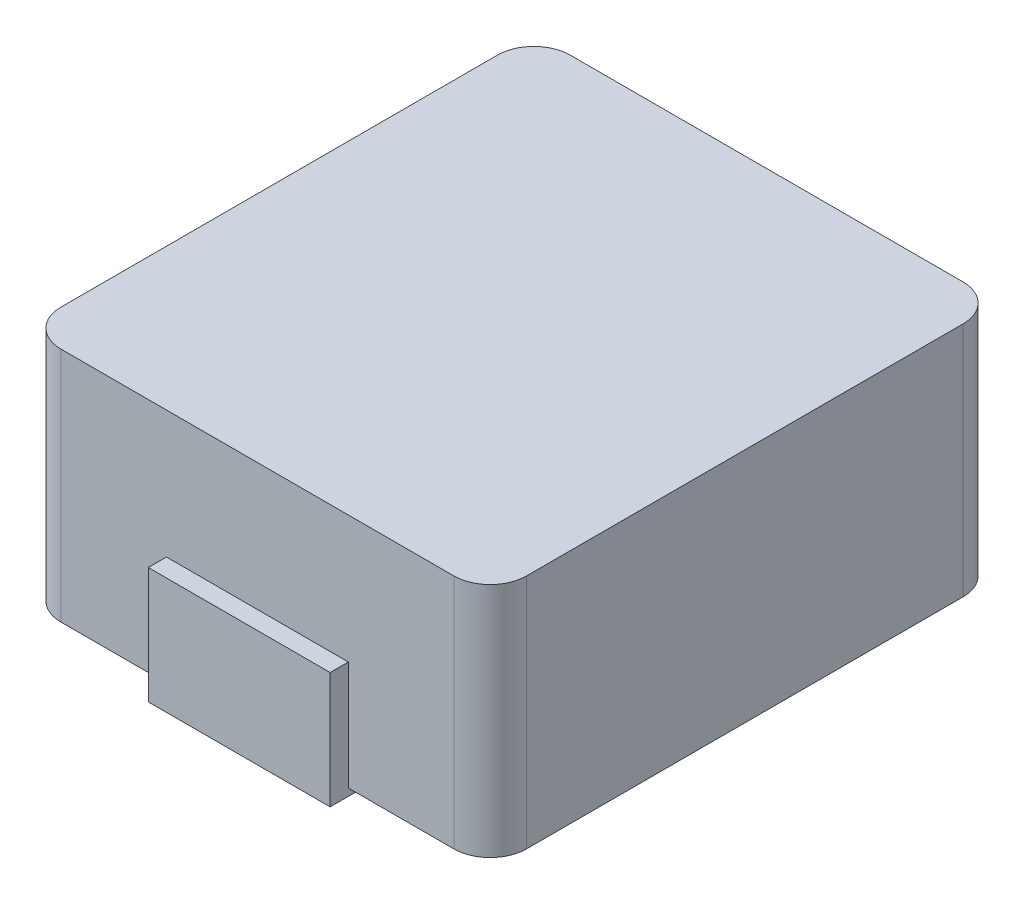
ISO-10303-21;
HEADER;
FILE_DESCRIPTION(('STEP AP214'),'2;1');
FILE_NAME('part.step','',(''),(''),'','','');
FILE_SCHEMA(('AUTOMOTIVE_DESIGN { 1 0 10303 214 1 1 1 1 }'));
ENDSEC;
DATA;
#1=APPLICATION_CONTEXT('core data for automotive mechanical design processes');
#2=APPLICATION_PROTOCOL_DEFINITION('international standard','automotive_design',2000,#1);
#3=PRODUCT_CONTEXT('',#1,'mechanical');
#4=PRODUCT('Part','Part','',(#3));
#5=PRODUCT_RELATED_PRODUCT_CATEGORY('part','',(#4));
#6=PRODUCT_DEFINITION_FORMATION('','',#4);
#7=PRODUCT_DEFINITION_CONTEXT('part definition',#1,'design');
#8=PRODUCT_DEFINITION('design','',#6,#7);
#9=PRODUCT_DEFINITION_SHAPE('','',#8);
#10=(LENGTH_UNIT() NAMED_UNIT(*) SI_UNIT(.MILLI.,.METRE.));
#11=(NAMED_UNIT(*) PLANE_ANGLE_UNIT() SI_UNIT($,.RADIAN.));
#12=(NAMED_UNIT(*) SI_UNIT($,.STERADIAN.) SOLID_ANGLE_UNIT());
#13=UNCERTAINTY_MEASURE_WITH_UNIT(LENGTH_MEASURE(1.E-05),#10,'distance_accuracy_value','');
#14=(GEOMETRIC_REPRESENTATION_CONTEXT(3) GLOBAL_UNCERTAINTY_ASSIGNED_CONTEXT((#13)) GLOBAL_UNIT_ASSIGNED_CONTEXT((#10,
#11,#12)) REPRESENTATION_CONTEXT('',''));
#15=CARTESIAN_POINT('',(0.,0.,0.));
#16=DIRECTION('',(0.,0.,1.));
#17=DIRECTION('',(1.,0.,0.));
#18=AXIS2_PLACEMENT_3D('',#15,#16,#17);
#19=CARTESIAN_POINT('',(0.,6.5,0.));
#20=DIRECTION('',(0.,0.,-1.));
#21=DIRECTION('',(-1.,0.,0.));
#22=AXIS2_PLACEMENT_3D('',#19,#20,#21);
#23=PLANE('',#22);
#24=DIRECTION('',(1.,0.,0.));
#25=VECTOR('',#24,1.);
#26=CARTESIAN_POINT('',(0.,3.,0.));
#27=LINE('',#26,#25);
#28=CARTESIAN_POINT('',(3.9,3.,0.));
#29=VERTEX_POINT('',#28);
#30=CARTESIAN_POINT('',(8.9,3.,0.));
#31=VERTEX_POINT('',#30);
#32=EDGE_CURVE('E318',#29,#31,#27,.T.);
#33=ORIENTED_EDGE('',*,*,#32,.T.);
#34=DIRECTION('',(0.,-1.,0.));
#35=VECTOR('',#34,1.);
#36=CARTESIAN_POINT('',(8.9,6.5,0.));
#37=LINE('',#36,#35);
#38=CARTESIAN_POINT('',(8.9,0.,0.));
#39=VERTEX_POINT('',#38);
#40=EDGE_CURVE('E243',#31,#39,#37,.T.);
#41=ORIENTED_EDGE('',*,*,#40,.T.);
#42=DIRECTION('',(1.,0.,0.));
#43=VECTOR('',#42,1.);
#44=CARTESIAN_POINT('',(0.,0.,0.));
#45=LINE('',#44,#43);
#46=CARTESIAN_POINT('',(11.8,0.,0.));
#47=VERTEX_POINT('',#46);
#48=EDGE_CURVE('E246',#39,#47,#45,.T.);
#49=ORIENTED_EDGE('',*,*,#48,.T.);
#50=DIRECTION('',(0.,-1.,0.));
#51=VECTOR('',#50,1.);
#52=CARTESIAN_POINT('',(11.8,6.5,0.));
#53=LINE('',#52,#51);
#54=CARTESIAN_POINT('',(11.8,6.5,0.));
#55=VERTEX_POINT('',#54);
#56=EDGE_CURVE('E300',#47,#55,#53,.F.);
#57=ORIENTED_EDGE('',*,*,#56,.T.);
#58=DIRECTION('',(1.,0.,0.));
#59=VECTOR('',#58,1.);
#60=CARTESIAN_POINT('',(0.,6.5,0.));
#61=LINE('',#60,#59);
#62=CARTESIAN_POINT('',(1.,6.5,0.));
#63=VERTEX_POINT('',#62);
#64=EDGE_CURVE('E247',#63,#55,#61,.T.);
#65=ORIENTED_EDGE('',*,*,#64,.F.);
#66=DIRECTION('',(0.,-1.,0.));
#67=VECTOR('',#66,1.);
#68=CARTESIAN_POINT('',(1.,6.5,0.));
#69=LINE('',#68,#67);
#70=CARTESIAN_POINT('',(1.,0.,0.));
#71=VERTEX_POINT('',#70);
#72=EDGE_CURVE('E302',#63,#71,#69,.T.);
#73=ORIENTED_EDGE('',*,*,#72,.T.);
#74=CARTESIAN_POINT('',(3.9,0.,0.));
#75=VERTEX_POINT('',#74);
#76=EDGE_CURVE('E261',#71,#75,#45,.T.);
#77=ORIENTED_EDGE('',*,*,#76,.T.);
#78=DIRECTION('',(0.,1.,0.));
#79=VECTOR('',#78,1.);
#80=CARTESIAN_POINT('',(3.9,6.5,0.));
#81=LINE('',#80,#79);
#82=EDGE_CURVE('E57',#75,#29,#81,.T.);
#83=ORIENTED_EDGE('',*,*,#82,.T.);
#84=EDGE_LOOP('',(#33,#41,#49,#57,#65,#73,#77,#83));
#85=FACE_BOUND('',#84,.T.);
#86=ADVANCED_FACE('F34',(#85),#23,.F.);
#87=CARTESIAN_POINT('',(12.8,6.5,0.));
#88=DIRECTION('',(-1.,0.,0.));
#89=DIRECTION('',(0.,0.,1.));
#90=AXIS2_PLACEMENT_3D('',#87,#88,#89);
#91=PLANE('',#90);
#92=DIRECTION('',(0.,0.,-1.));
#93=VECTOR('',#92,1.);
#94=CARTESIAN_POINT('',(12.8,0.,0.));
#95=LINE('',#94,#93);
#96=CARTESIAN_POINT('',(12.8,0.,-1.));
#97=VERTEX_POINT('',#96);
#98=CARTESIAN_POINT('',(12.8,0.,-13.));
#99=VERTEX_POINT('',#98);
#100=EDGE_CURVE('E264',#97,#99,#95,.T.);
#101=ORIENTED_EDGE('',*,*,#100,.T.);
#102=DIRECTION('',(0.,-1.,0.));
#103=VECTOR('',#102,1.);
#104=CARTESIAN_POINT('',(12.8,6.5,-13.));
#105=LINE('',#104,#103);
#106=CARTESIAN_POINT('',(12.8,6.5,-13.));
#107=VERTEX_POINT('',#106);
#108=EDGE_CURVE('E308',#99,#107,#105,.F.);
#109=ORIENTED_EDGE('',*,*,#108,.T.);
#110=DIRECTION('',(0.,0.,-1.));
#111=VECTOR('',#110,1.);
#112=CARTESIAN_POINT('',(12.8,6.5,0.));
#113=LINE('',#112,#111);
#114=CARTESIAN_POINT('',(12.8,6.5,-1.));
#115=VERTEX_POINT('',#114);
#116=EDGE_CURVE('E250',#115,#107,#113,.T.);
#117=ORIENTED_EDGE('',*,*,#116,.F.);
#118=DIRECTION('',(0.,-1.,0.));
#119=VECTOR('',#118,1.);
#120=CARTESIAN_POINT('',(12.8,6.5,-1.));
#121=LINE('',#120,#119);
#122=EDGE_CURVE('E305',#115,#97,#121,.T.);
#123=ORIENTED_EDGE('',*,*,#122,.T.);
#124=EDGE_LOOP('',(#101,#109,#117,#123));
#125=FACE_BOUND('',#124,.T.);
#126=ADVANCED_FACE('F349',(#125),#91,.F.);
#127=CARTESIAN_POINT('',(0.,6.5,-14.));
#128=DIRECTION('',(0.,0.,1.));
#129=DIRECTION('',(1.,0.,0.));
#130=AXIS2_PLACEMENT_3D('',#127,#128,#129);
#131=PLANE('',#130);
#132=DIRECTION('',(1.,0.,0.));
#133=VECTOR('',#132,1.);
#134=CARTESIAN_POINT('',(0.,3.,-14.));
#135=LINE('',#134,#133);
#136=CARTESIAN_POINT('',(3.90000000000001,3.,-14.));
#137=VERTEX_POINT('',#136);
#138=CARTESIAN_POINT('',(8.9,3.,-14.));
#139=VERTEX_POINT('',#138);
#140=EDGE_CURVE('E11',#137,#139,#135,.T.);
#141=ORIENTED_EDGE('',*,*,#140,.F.);
#142=DIRECTION('',(0.,-1.,0.));
#143=VECTOR('',#142,1.);
#144=CARTESIAN_POINT('',(3.90000000000001,6.5,-14.));
#145=LINE('',#144,#143);
#146=CARTESIAN_POINT('',(3.90000000000001,0.,-14.));
#147=VERTEX_POINT('',#146);
#148=EDGE_CURVE('E212',#137,#147,#145,.T.);
#149=ORIENTED_EDGE('',*,*,#148,.T.);
#150=DIRECTION('',(-1.,0.,0.));
#151=VECTOR('',#150,1.);
#152=CARTESIAN_POINT('',(0.,0.,-14.));
#153=LINE('',#152,#151);
#154=CARTESIAN_POINT('',(1.,0.,-14.));
#155=VERTEX_POINT('',#154);
#156=EDGE_CURVE('E267',#147,#155,#153,.T.);
#157=ORIENTED_EDGE('',*,*,#156,.T.);
#158=DIRECTION('',(0.,-1.,0.));
#159=VECTOR('',#158,1.);
#160=CARTESIAN_POINT('',(1.,6.5,-14.));
#161=LINE('',#160,#159);
#162=CARTESIAN_POINT('',(1.,6.5,-14.));
#163=VERTEX_POINT('',#162);
#164=EDGE_CURVE('E290',#155,#163,#161,.F.);
#165=ORIENTED_EDGE('',*,*,#164,.T.);
#166=DIRECTION('',(-1.,0.,0.));
#167=VECTOR('',#166,1.);
#168=CARTESIAN_POINT('',(0.,6.5,-14.));
#169=LINE('',#168,#167);
#170=CARTESIAN_POINT('',(11.8,6.5,-14.));
#171=VERTEX_POINT('',#170);
#172=EDGE_CURVE('E254',#171,#163,#169,.T.);
#173=ORIENTED_EDGE('',*,*,#172,.F.);
#174=DIRECTION('',(0.,-1.,0.));
#175=VECTOR('',#174,1.);
#176=CARTESIAN_POINT('',(11.8,6.5,-14.));
#177=LINE('',#176,#175);
#178=CARTESIAN_POINT('',(11.8,0.,-14.));
#179=VERTEX_POINT('',#178);
#180=EDGE_CURVE('E287',#171,#179,#177,.T.);
#181=ORIENTED_EDGE('',*,*,#180,.T.);
#182=CARTESIAN_POINT('',(8.9,0.,-14.));
#183=VERTEX_POINT('',#182);
#184=EDGE_CURVE('E268',#179,#183,#153,.T.);
#185=ORIENTED_EDGE('',*,*,#184,.T.);
#186=DIRECTION('',(0.,1.,0.));
#187=VECTOR('',#186,1.);
#188=CARTESIAN_POINT('',(8.9,6.5,-14.));
#189=LINE('',#188,#187);
#190=EDGE_CURVE('E49',#183,#139,#189,.T.);
#191=ORIENTED_EDGE('',*,*,#190,.T.);
#192=EDGE_LOOP('',(#141,#149,#157,#165,#173,#181,#185,#191));
#193=FACE_BOUND('',#192,.T.);
#194=ADVANCED_FACE('F331',(#193),#131,.F.);
#195=CARTESIAN_POINT('',(0.,6.5,0.));
#196=DIRECTION('',(1.,0.,0.));
#197=DIRECTION('',(0.,0.,-1.));
#198=AXIS2_PLACEMENT_3D('',#195,#196,#197);
#199=PLANE('',#198);
#200=DIRECTION('',(0.,0.,1.));
#201=VECTOR('',#200,1.);
#202=CARTESIAN_POINT('',(0.,6.5,0.));
#203=LINE('',#202,#201);
#204=CARTESIAN_POINT('',(0.,6.5,-13.));
#205=VERTEX_POINT('',#204);
#206=CARTESIAN_POINT('',(0.,6.5,-1.));
#207=VERTEX_POINT('',#206);
#208=EDGE_CURVE('E257',#205,#207,#203,.T.);
#209=ORIENTED_EDGE('',*,*,#208,.F.);
#210=DIRECTION('',(0.,-1.,0.));
#211=VECTOR('',#210,1.);
#212=CARTESIAN_POINT('',(0.,6.5,-13.));
#213=LINE('',#212,#211);
#214=CARTESIAN_POINT('',(0.,0.,-13.));
#215=VERTEX_POINT('',#214);
#216=EDGE_CURVE('E274',#205,#215,#213,.T.);
#217=ORIENTED_EDGE('',*,*,#216,.T.);
#218=DIRECTION('',(0.,0.,1.));
#219=VECTOR('',#218,1.);
#220=CARTESIAN_POINT('',(0.,0.,0.));
#221=LINE('',#220,#219);
#222=CARTESIAN_POINT('',(0.,0.,-1.));
#223=VERTEX_POINT('',#222);
#224=EDGE_CURVE('E251',#215,#223,#221,.T.);
#225=ORIENTED_EDGE('',*,*,#224,.T.);
#226=DIRECTION('',(0.,-1.,0.));
#227=VECTOR('',#226,1.);
#228=CARTESIAN_POINT('',(0.,6.5,-1.));
#229=LINE('',#228,#227);
#230=EDGE_CURVE('E260',#223,#207,#229,.F.);
#231=ORIENTED_EDGE('',*,*,#230,.T.);
#232=EDGE_LOOP('',(#209,#217,#225,#231));
#233=FACE_BOUND('',#232,.T.);
#234=ADVANCED_FACE('F388',(#233),#199,.F.);
#235=CARTESIAN_POINT('',(0.,6.5,0.));
#236=DIRECTION('',(0.,1.,0.));
#237=DIRECTION('',(0.,0.,1.));
#238=AXIS2_PLACEMENT_3D('',#235,#236,#237);
#239=PLANE('',#238);
#240=ORIENTED_EDGE('',*,*,#172,.T.);
#241=CARTESIAN_POINT('',(1.,6.5,-13.));
#242=DIRECTION('',(0.,1.,0.));
#243=DIRECTION('',(0.,0.,1.));
#244=AXIS2_PLACEMENT_3D('',#241,#242,#243);
#245=CIRCLE('',#244,1.);
#246=EDGE_CURVE('E298',#163,#205,#245,.T.);
#247=ORIENTED_EDGE('',*,*,#246,.T.);
#248=ORIENTED_EDGE('',*,*,#208,.T.);
#249=CARTESIAN_POINT('',(1.,6.5,-1.));
#250=DIRECTION('',(0.,1.,0.));
#251=DIRECTION('',(0.,0.,1.));
#252=AXIS2_PLACEMENT_3D('',#249,#250,#251);
#253=CIRCLE('',#252,1.);
#254=EDGE_CURVE('E296',#207,#63,#253,.T.);
#255=ORIENTED_EDGE('',*,*,#254,.T.);
#256=ORIENTED_EDGE('',*,*,#64,.T.);
#257=CARTESIAN_POINT('',(11.8,6.5,-1.));
#258=DIRECTION('',(0.,1.,0.));
#259=DIRECTION('',(0.,0.,1.));
#260=AXIS2_PLACEMENT_3D('',#257,#258,#259);
#261=CIRCLE('',#260,1.);
#262=EDGE_CURVE('E292',#55,#115,#261,.T.);
#263=ORIENTED_EDGE('',*,*,#262,.T.);
#264=ORIENTED_EDGE('',*,*,#116,.T.);
#265=CARTESIAN_POINT('',(11.8,6.5,-13.));
#266=DIRECTION('',(0.,1.,0.));
#267=DIRECTION('',(0.,0.,1.));
#268=AXIS2_PLACEMENT_3D('',#265,#266,#267);
#269=CIRCLE('',#268,1.);
#270=EDGE_CURVE('E294',#107,#171,#269,.T.);
#271=ORIENTED_EDGE('',*,*,#270,.T.);
#272=EDGE_LOOP('',(#240,#247,#248,#255,#256,#263,#264,#271));
#273=FACE_BOUND('',#272,.T.);
#274=ADVANCED_FACE('F379',(#273),#239,.T.);
#275=CARTESIAN_POINT('',(0.,0.,0.));
#276=DIRECTION('',(0.,1.,0.));
#277=DIRECTION('',(0.,0.,1.));
#278=AXIS2_PLACEMENT_3D('',#275,#276,#277);
#279=PLANE('',#278);
#280=ORIENTED_EDGE('',*,*,#156,.F.);
#281=DIRECTION('',(0.,0.,1.));
#282=VECTOR('',#281,1.);
#283=CARTESIAN_POINT('',(3.90000000000001,0.,0.));
#284=LINE('',#283,#282);
#285=CARTESIAN_POINT('',(3.90000000000001,0.,-11.4));
#286=VERTEX_POINT('',#285);
#287=EDGE_CURVE('E42',#147,#286,#284,.T.);
#288=ORIENTED_EDGE('',*,*,#287,.T.);
#289=DIRECTION('',(1.,0.,0.));
#290=VECTOR('',#289,1.);
#291=CARTESIAN_POINT('',(0.,0.,-11.4));
#292=LINE('',#291,#290);
#293=CARTESIAN_POINT('',(8.9,0.,-11.4));
#294=VERTEX_POINT('',#293);
#295=EDGE_CURVE('E323',#286,#294,#292,.T.);
#296=ORIENTED_EDGE('',*,*,#295,.T.);
#297=DIRECTION('',(0.,0.,-1.));
#298=VECTOR('',#297,1.);
#299=CARTESIAN_POINT('',(8.9,0.,0.));
#300=LINE('',#299,#298);
#301=EDGE_CURVE('E321',#294,#183,#300,.T.);
#302=ORIENTED_EDGE('',*,*,#301,.T.);
#303=ORIENTED_EDGE('',*,*,#184,.F.);
#304=CARTESIAN_POINT('',(11.8,0.,-13.));
#305=DIRECTION('',(0.,1.,0.));
#306=DIRECTION('',(0.,0.,1.));
#307=AXIS2_PLACEMENT_3D('',#304,#305,#306);
#308=CIRCLE('',#307,1.);
#309=EDGE_CURVE('E280',#179,#99,#308,.F.);
#310=ORIENTED_EDGE('',*,*,#309,.T.);
#311=ORIENTED_EDGE('',*,*,#100,.F.);
#312=CARTESIAN_POINT('',(11.8,0.,-1.));
#313=DIRECTION('',(0.,1.,0.));
#314=DIRECTION('',(0.,0.,1.));
#315=AXIS2_PLACEMENT_3D('',#312,#313,#314);
#316=CIRCLE('',#315,1.);
#317=EDGE_CURVE('E277',#97,#47,#316,.F.);
#318=ORIENTED_EDGE('',*,*,#317,.T.);
#319=ORIENTED_EDGE('',*,*,#48,.F.);
#320=DIRECTION('',(0.,0.,-1.));
#321=VECTOR('',#320,1.);
#322=CARTESIAN_POINT('',(8.9,0.,0.));
#323=LINE('',#322,#321);
#324=CARTESIAN_POINT('',(8.9,0.,-2.6));
#325=VERTEX_POINT('',#324);
#326=EDGE_CURVE('E315',#39,#325,#323,.T.);
#327=ORIENTED_EDGE('',*,*,#326,.T.);
#328=DIRECTION('',(-1.,0.,0.));
#329=VECTOR('',#328,1.);
#330=CARTESIAN_POINT('',(0.,0.,-2.6));
#331=LINE('',#330,#329);
#332=CARTESIAN_POINT('',(3.9,0.,-2.6));
#333=VERTEX_POINT('',#332);
#334=EDGE_CURVE('E312',#325,#333,#331,.T.);
#335=ORIENTED_EDGE('',*,*,#334,.T.);
#336=DIRECTION('',(0.,0.,1.));
#337=VECTOR('',#336,1.);
#338=CARTESIAN_POINT('',(3.9,0.,0.));
#339=LINE('',#338,#337);
#340=EDGE_CURVE('E310',#333,#75,#339,.T.);
#341=ORIENTED_EDGE('',*,*,#340,.T.);
#342=ORIENTED_EDGE('',*,*,#76,.F.);
#343=CARTESIAN_POINT('',(1.,0.,-1.));
#344=DIRECTION('',(0.,1.,0.));
#345=DIRECTION('',(0.,0.,1.));
#346=AXIS2_PLACEMENT_3D('',#343,#344,#345);
#347=CIRCLE('',#346,1.);
#348=EDGE_CURVE('E282',#71,#223,#347,.F.);
#349=ORIENTED_EDGE('',*,*,#348,.T.);
#350=ORIENTED_EDGE('',*,*,#224,.F.);
#351=CARTESIAN_POINT('',(1.,0.,-13.));
#352=DIRECTION('',(0.,1.,0.));
#353=DIRECTION('',(0.,0.,1.));
#354=AXIS2_PLACEMENT_3D('',#351,#352,#353);
#355=CIRCLE('',#354,1.);
#356=EDGE_CURVE('E284',#215,#155,#355,.F.);
#357=ORIENTED_EDGE('',*,*,#356,.T.);
#358=EDGE_LOOP('',(#280,#288,#296,#302,#303,#310,#311,#318,#319,#327,#335,#341,#342,#349,#350,#357));
#359=FACE_BOUND('',#358,.T.);
#360=ADVANCED_FACE('F328',(#359),#279,.F.);
#361=CARTESIAN_POINT('',(1.,6.5,-13.));
#362=DIRECTION('',(0.,-1.,0.));
#363=DIRECTION('',(0.,0.,-1.));
#364=AXIS2_PLACEMENT_3D('',#361,#362,#363);
#365=CYLINDRICAL_SURFACE('',#364,1.);
#366=ORIENTED_EDGE('',*,*,#246,.F.);
#367=ORIENTED_EDGE('',*,*,#164,.F.);
#368=ORIENTED_EDGE('',*,*,#356,.F.);
#369=ORIENTED_EDGE('',*,*,#216,.F.);
#370=EDGE_LOOP('',(#366,#367,#368,#369));
#371=FACE_BOUND('',#370,.T.);
#372=ADVANCED_FACE('F359',(#371),#365,.T.);
#373=CARTESIAN_POINT('',(1.,6.5,-1.));
#374=DIRECTION('',(0.,-1.,0.));
#375=DIRECTION('',(0.,0.,-1.));
#376=AXIS2_PLACEMENT_3D('',#373,#374,#375);
#377=CYLINDRICAL_SURFACE('',#376,1.);
#378=ORIENTED_EDGE('',*,*,#254,.F.);
#379=ORIENTED_EDGE('',*,*,#230,.F.);
#380=ORIENTED_EDGE('',*,*,#348,.F.);
#381=ORIENTED_EDGE('',*,*,#72,.F.);
#382=EDGE_LOOP('',(#378,#379,#380,#381));
#383=FACE_BOUND('',#382,.T.);
#384=ADVANCED_FACE('F362',(#383),#377,.T.);
#385=CARTESIAN_POINT('',(11.8,6.5,-13.));
#386=DIRECTION('',(0.,-1.,0.));
#387=DIRECTION('',(0.,0.,-1.));
#388=AXIS2_PLACEMENT_3D('',#385,#386,#387);
#389=CYLINDRICAL_SURFACE('',#388,1.);
#390=ORIENTED_EDGE('',*,*,#270,.F.);
#391=ORIENTED_EDGE('',*,*,#108,.F.);
#392=ORIENTED_EDGE('',*,*,#309,.F.);
#393=ORIENTED_EDGE('',*,*,#180,.F.);
#394=EDGE_LOOP('',(#390,#391,#392,#393));
#395=FACE_BOUND('',#394,.T.);
#396=ADVANCED_FACE('F365',(#395),#389,.T.);
#397=CARTESIAN_POINT('',(11.8,6.5,-1.));
#398=DIRECTION('',(0.,-1.,0.));
#399=DIRECTION('',(0.,0.,-1.));
#400=AXIS2_PLACEMENT_3D('',#397,#398,#399);
#401=CYLINDRICAL_SURFACE('',#400,1.);
#402=ORIENTED_EDGE('',*,*,#262,.F.);
#403=ORIENTED_EDGE('',*,*,#56,.F.);
#404=ORIENTED_EDGE('',*,*,#317,.F.);
#405=ORIENTED_EDGE('',*,*,#122,.F.);
#406=EDGE_LOOP('',(#402,#403,#404,#405));
#407=FACE_BOUND('',#406,.T.);
#408=ADVANCED_FACE('F36',(#407),#401,.T.);
#409=CARTESIAN_POINT('',(0.,3.,0.));
#410=DIRECTION('',(0.,1.,0.));
#411=DIRECTION('',(0.,0.,1.));
#412=AXIS2_PLACEMENT_3D('',#409,#410,#411);
#413=PLANE('',#412);
#414=ORIENTED_EDGE('',*,*,#32,.F.);
#415=DIRECTION('',(0.,0.,-1.));
#416=VECTOR('',#415,1.);
#417=CARTESIAN_POINT('',(3.9,3.,-2.6));
#418=LINE('',#417,#416);
#419=CARTESIAN_POINT('',(3.9,3.,0.5));
#420=VERTEX_POINT('',#419);
#421=EDGE_CURVE('E232',#420,#29,#418,.T.);
#422=ORIENTED_EDGE('',*,*,#421,.F.);
#423=DIRECTION('',(-1.,0.,0.));
#424=VECTOR('',#423,1.);
#425=CARTESIAN_POINT('',(3.9,3.,0.5));
#426=LINE('',#425,#424);
#427=CARTESIAN_POINT('',(8.9,3.,0.5));
#428=VERTEX_POINT('',#427);
#429=EDGE_CURVE('E229',#428,#420,#426,.T.);
#430=ORIENTED_EDGE('',*,*,#429,.F.);
#431=DIRECTION('',(0.,0.,1.));
#432=VECTOR('',#431,1.);
#433=CARTESIAN_POINT('',(8.9,3.,0.));
#434=LINE('',#433,#432);
#435=EDGE_CURVE('E227',#31,#428,#434,.T.);
#436=ORIENTED_EDGE('',*,*,#435,.F.);
#437=EDGE_LOOP('',(#414,#422,#430,#436));
#438=FACE_BOUND('',#437,.T.);
#439=ADVANCED_FACE('F372',(#438),#413,.T.);
#440=CARTESIAN_POINT('',(8.9,3.,0.));
#441=DIRECTION('',(1.,0.,0.));
#442=DIRECTION('',(0.,0.,-1.));
#443=AXIS2_PLACEMENT_3D('',#440,#441,#442);
#444=PLANE('',#443);
#445=ORIENTED_EDGE('',*,*,#40,.F.);
#446=ORIENTED_EDGE('',*,*,#435,.T.);
#447=DIRECTION('',(0.,-1.,0.));
#448=VECTOR('',#447,1.);
#449=CARTESIAN_POINT('',(8.9,3.,0.5));
#450=LINE('',#449,#448);
#451=CARTESIAN_POINT('',(8.9,-0.2,0.5));
#452=VERTEX_POINT('',#451);
#453=EDGE_CURVE('E234',#428,#452,#450,.T.);
#454=ORIENTED_EDGE('',*,*,#453,.T.);
#455=DIRECTION('',(0.,0.,1.));
#456=VECTOR('',#455,1.);
#457=CARTESIAN_POINT('',(8.9,-0.2,0.));
#458=LINE('',#457,#456);
#459=CARTESIAN_POINT('',(8.9,-0.2,-2.6));
#460=VERTEX_POINT('',#459);
#461=EDGE_CURVE('E215',#460,#452,#458,.T.);
#462=ORIENTED_EDGE('',*,*,#461,.F.);
#463=DIRECTION('',(0.,-1.,0.));
#464=VECTOR('',#463,1.);
#465=CARTESIAN_POINT('',(8.9,3.,-2.6));
#466=LINE('',#465,#464);
#467=EDGE_CURVE('E235',#325,#460,#466,.T.);
#468=ORIENTED_EDGE('',*,*,#467,.F.);
#469=ORIENTED_EDGE('',*,*,#326,.F.);
#470=EDGE_LOOP('',(#445,#446,#454,#462,#468,#469));
#471=FACE_BOUND('',#470,.T.);
#472=ADVANCED_FACE('F401',(#471),#444,.T.);
#473=CARTESIAN_POINT('',(8.9,3.,-2.6));
#474=DIRECTION('',(0.,0.,-1.));
#475=DIRECTION('',(-1.,0.,0.));
#476=AXIS2_PLACEMENT_3D('',#473,#474,#475);
#477=PLANE('',#476);
#478=ORIENTED_EDGE('',*,*,#334,.F.);
#479=ORIENTED_EDGE('',*,*,#467,.T.);
#480=DIRECTION('',(1.,0.,0.));
#481=VECTOR('',#480,1.);
#482=CARTESIAN_POINT('',(8.9,-0.2,-2.6));
#483=LINE('',#482,#481);
#484=CARTESIAN_POINT('',(3.9,-0.2,-2.6));
#485=VERTEX_POINT('',#484);
#486=EDGE_CURVE('E224',#485,#460,#483,.T.);
#487=ORIENTED_EDGE('',*,*,#486,.F.);
#488=DIRECTION('',(0.,-1.,0.));
#489=VECTOR('',#488,1.);
#490=CARTESIAN_POINT('',(3.9,3.,-2.6));
#491=LINE('',#490,#489);
#492=EDGE_CURVE('E237',#333,#485,#491,.T.);
#493=ORIENTED_EDGE('',*,*,#492,.F.);
#494=EDGE_LOOP('',(#478,#479,#487,#493));
#495=FACE_BOUND('',#494,.T.);
#496=ADVANCED_FACE('F418',(#495),#477,.T.);
#497=CARTESIAN_POINT('',(3.9,3.,-2.6));
#498=DIRECTION('',(-1.,0.,0.));
#499=DIRECTION('',(0.,0.,1.));
#500=AXIS2_PLACEMENT_3D('',#497,#498,#499);
#501=PLANE('',#500);
#502=ORIENTED_EDGE('',*,*,#82,.F.);
#503=ORIENTED_EDGE('',*,*,#340,.F.);
#504=ORIENTED_EDGE('',*,*,#492,.T.);
#505=DIRECTION('',(0.,0.,-1.));
#506=VECTOR('',#505,1.);
#507=CARTESIAN_POINT('',(3.9,-0.2,-2.6));
#508=LINE('',#507,#506);
#509=CARTESIAN_POINT('',(3.9,-0.2,0.5));
#510=VERTEX_POINT('',#509);
#511=EDGE_CURVE('E221',#510,#485,#508,.T.);
#512=ORIENTED_EDGE('',*,*,#511,.F.);
#513=DIRECTION('',(0.,-1.,0.));
#514=VECTOR('',#513,1.);
#515=CARTESIAN_POINT('',(3.9,3.,0.5));
#516=LINE('',#515,#514);
#517=EDGE_CURVE('E239',#420,#510,#516,.T.);
#518=ORIENTED_EDGE('',*,*,#517,.F.);
#519=ORIENTED_EDGE('',*,*,#421,.T.);
#520=EDGE_LOOP('',(#502,#503,#504,#512,#518,#519));
#521=FACE_BOUND('',#520,.T.);
#522=ADVANCED_FACE('F407',(#521),#501,.T.);
#523=CARTESIAN_POINT('',(3.9,3.,0.5));
#524=DIRECTION('',(0.,0.,1.));
#525=DIRECTION('',(1.,0.,0.));
#526=AXIS2_PLACEMENT_3D('',#523,#524,#525);
#527=PLANE('',#526);
#528=ORIENTED_EDGE('',*,*,#517,.T.);
#529=DIRECTION('',(-1.,0.,0.));
#530=VECTOR('',#529,1.);
#531=CARTESIAN_POINT('',(3.9,-0.2,0.5));
#532=LINE('',#531,#530);
#533=EDGE_CURVE('E218',#452,#510,#532,.T.);
#534=ORIENTED_EDGE('',*,*,#533,.F.);
#535=ORIENTED_EDGE('',*,*,#453,.F.);
#536=ORIENTED_EDGE('',*,*,#429,.T.);
#537=EDGE_LOOP('',(#528,#534,#535,#536));
#538=FACE_BOUND('',#537,.T.);
#539=ADVANCED_FACE('F411',(#538),#527,.T.);
#540=CARTESIAN_POINT('',(0.,-0.2,0.));
#541=DIRECTION('',(0.,1.,0.));
#542=DIRECTION('',(0.,0.,1.));
#543=AXIS2_PLACEMENT_3D('',#540,#541,#542);
#544=PLANE('',#543);
#545=ORIENTED_EDGE('',*,*,#461,.T.);
#546=ORIENTED_EDGE('',*,*,#533,.T.);
#547=ORIENTED_EDGE('',*,*,#511,.T.);
#548=ORIENTED_EDGE('',*,*,#486,.T.);
#549=EDGE_LOOP('',(#545,#546,#547,#548));
#550=FACE_BOUND('',#549,.T.);
#551=ADVANCED_FACE('F414',(#550),#544,.F.);
#552=CARTESIAN_POINT('',(0.,3.,0.));
#553=DIRECTION('',(0.,-1.,0.));
#554=DIRECTION('',(0.,0.,-1.));
#555=AXIS2_PLACEMENT_3D('',#552,#553,#554);
#556=PLANE('',#555);
#557=DIRECTION('',(0.,0.,-1.));
#558=VECTOR('',#557,1.);
#559=CARTESIAN_POINT('',(3.90000000000001,3.,-11.4));
#560=LINE('',#559,#558);
#561=CARTESIAN_POINT('',(3.90000000000001,3.,-14.5));
#562=VERTEX_POINT('',#561);
#563=EDGE_CURVE('E179',#137,#562,#560,.T.);
#564=ORIENTED_EDGE('',*,*,#563,.F.);
#565=ORIENTED_EDGE('',*,*,#140,.T.);
#566=DIRECTION('',(0.,0.,1.));
#567=VECTOR('',#566,1.);
#568=CARTESIAN_POINT('',(8.9,3.,-14.));
#569=LINE('',#568,#567);
#570=CARTESIAN_POINT('',(8.9,3.,-14.5));
#571=VERTEX_POINT('',#570);
#572=EDGE_CURVE('E184',#571,#139,#569,.T.);
#573=ORIENTED_EDGE('',*,*,#572,.F.);
#574=DIRECTION('',(1.,0.,0.));
#575=VECTOR('',#574,1.);
#576=CARTESIAN_POINT('',(3.90000000000001,3.,-14.5));
#577=LINE('',#576,#575);
#578=EDGE_CURVE('E203',#562,#571,#577,.T.);
#579=ORIENTED_EDGE('',*,*,#578,.F.);
#580=EDGE_LOOP('',(#564,#565,#573,#579));
#581=FACE_BOUND('',#580,.T.);
#582=ADVANCED_FACE('F334',(#581),#556,.F.);
#583=CARTESIAN_POINT('',(3.90000000000001,3.,-11.4));
#584=DIRECTION('',(-1.,0.,0.));
#585=DIRECTION('',(0.,0.,1.));
#586=AXIS2_PLACEMENT_3D('',#583,#584,#585);
#587=PLANE('',#586);
#588=ORIENTED_EDGE('',*,*,#148,.F.);
#589=ORIENTED_EDGE('',*,*,#563,.T.);
#590=DIRECTION('',(0.,-1.,0.));
#591=VECTOR('',#590,1.);
#592=CARTESIAN_POINT('',(3.90000000000001,3.,-14.5));
#593=LINE('',#592,#591);
#594=CARTESIAN_POINT('',(3.90000000000001,-0.2,-14.5));
#595=VERTEX_POINT('',#594);
#596=EDGE_CURVE('E172',#562,#595,#593,.T.);
#597=ORIENTED_EDGE('',*,*,#596,.T.);
#598=DIRECTION('',(0.,0.,-1.));
#599=VECTOR('',#598,1.);
#600=CARTESIAN_POINT('',(3.90000000000001,-0.2,-11.4));
#601=LINE('',#600,#599);
#602=CARTESIAN_POINT('',(3.90000000000001,-0.2,-11.4));
#603=VERTEX_POINT('',#602);
#604=EDGE_CURVE('E177',#603,#595,#601,.T.);
#605=ORIENTED_EDGE('',*,*,#604,.F.);
#606=DIRECTION('',(0.,-1.,0.));
#607=VECTOR('',#606,1.);
#608=CARTESIAN_POINT('',(3.90000000000001,3.,-11.4));
#609=LINE('',#608,#607);
#610=EDGE_CURVE('E206',#286,#603,#609,.T.);
#611=ORIENTED_EDGE('',*,*,#610,.F.);
#612=ORIENTED_EDGE('',*,*,#287,.F.);
#613=EDGE_LOOP('',(#588,#589,#597,#605,#611,#612));
#614=FACE_BOUND('',#613,.T.);
#615=ADVANCED_FACE('F174',(#614),#587,.T.);
#616=CARTESIAN_POINT('',(8.9,3.,-11.4));
#617=DIRECTION('',(0.,0.,1.));
#618=DIRECTION('',(1.,0.,0.));
#619=AXIS2_PLACEMENT_3D('',#616,#617,#618);
#620=PLANE('',#619);
#621=ORIENTED_EDGE('',*,*,#295,.F.);
#622=ORIENTED_EDGE('',*,*,#610,.T.);
#623=DIRECTION('',(-1.,0.,0.));
#624=VECTOR('',#623,1.);
#625=CARTESIAN_POINT('',(8.9,-0.2,-11.4));
#626=LINE('',#625,#624);
#627=CARTESIAN_POINT('',(8.9,-0.2,-11.4));
#628=VERTEX_POINT('',#627);
#629=EDGE_CURVE('E197',#628,#603,#626,.T.);
#630=ORIENTED_EDGE('',*,*,#629,.F.);
#631=DIRECTION('',(0.,-1.,0.));
#632=VECTOR('',#631,1.);
#633=CARTESIAN_POINT('',(8.9,3.,-11.4));
#634=LINE('',#633,#632);
#635=EDGE_CURVE('E208',#294,#628,#634,.T.);
#636=ORIENTED_EDGE('',*,*,#635,.F.);
#637=EDGE_LOOP('',(#621,#622,#630,#636));
#638=FACE_BOUND('',#637,.T.);
#639=ADVANCED_FACE('F338',(#638),#620,.T.);
#640=CARTESIAN_POINT('',(8.9,3.,-14.));
#641=DIRECTION('',(1.,0.,0.));
#642=DIRECTION('',(0.,0.,-1.));
#643=AXIS2_PLACEMENT_3D('',#640,#641,#642);
#644=PLANE('',#643);
#645=ORIENTED_EDGE('',*,*,#190,.F.);
#646=ORIENTED_EDGE('',*,*,#301,.F.);
#647=ORIENTED_EDGE('',*,*,#635,.T.);
#648=DIRECTION('',(0.,0.,1.));
#649=VECTOR('',#648,1.);
#650=CARTESIAN_POINT('',(8.9,-0.2,-14.));
#651=LINE('',#650,#649);
#652=CARTESIAN_POINT('',(8.9,-0.2,-14.5));
#653=VERTEX_POINT('',#652);
#654=EDGE_CURVE('E192',#653,#628,#651,.T.);
#655=ORIENTED_EDGE('',*,*,#654,.F.);
#656=DIRECTION('',(0.,-1.,0.));
#657=VECTOR('',#656,1.);
#658=CARTESIAN_POINT('',(8.9,3.,-14.5));
#659=LINE('',#658,#657);
#660=EDGE_CURVE('E183',#571,#653,#659,.T.);
#661=ORIENTED_EDGE('',*,*,#660,.F.);
#662=ORIENTED_EDGE('',*,*,#572,.T.);
#663=EDGE_LOOP('',(#645,#646,#647,#655,#661,#662));
#664=FACE_BOUND('',#663,.T.);
#665=ADVANCED_FACE('F335',(#664),#644,.T.);
#666=CARTESIAN_POINT('',(3.90000000000001,3.,-14.5));
#667=DIRECTION('',(0.,0.,-1.));
#668=DIRECTION('',(-1.,0.,0.));
#669=AXIS2_PLACEMENT_3D('',#666,#667,#668);
#670=PLANE('',#669);
#671=ORIENTED_EDGE('',*,*,#660,.T.);
#672=DIRECTION('',(1.,0.,0.));
#673=VECTOR('',#672,1.);
#674=CARTESIAN_POINT('',(3.90000000000001,-0.2,-14.5));
#675=LINE('',#674,#673);
#676=EDGE_CURVE('E187',#595,#653,#675,.T.);
#677=ORIENTED_EDGE('',*,*,#676,.F.);
#678=ORIENTED_EDGE('',*,*,#596,.F.);
#679=ORIENTED_EDGE('',*,*,#578,.T.);
#680=EDGE_LOOP('',(#671,#677,#678,#679));
#681=FACE_BOUND('',#680,.T.);
#682=ADVANCED_FACE('F188',(#681),#670,.T.);
#683=CARTESIAN_POINT('',(0.,-0.2,0.));
#684=DIRECTION('',(0.,-1.,0.));
#685=DIRECTION('',(0.,0.,-1.));
#686=AXIS2_PLACEMENT_3D('',#683,#684,#685);
#687=PLANE('',#686);
#688=ORIENTED_EDGE('',*,*,#604,.T.);
#689=ORIENTED_EDGE('',*,*,#676,.T.);
#690=ORIENTED_EDGE('',*,*,#654,.T.);
#691=ORIENTED_EDGE('',*,*,#629,.T.);
#692=EDGE_LOOP('',(#688,#689,#690,#691));
#693=FACE_BOUND('',#692,.T.);
#694=ADVANCED_FACE('F195',(#693),#687,.T.);
#695=CLOSED_SHELL('',(#86,#126,#194,#234,#274,#360,#372,#384,#396,#408,#439,#472,#496,#522,#539,
#551,#582,#615,#639,#665,#682,#694));
#696=MANIFOLD_SOLID_BREP('B2',#695);
#697=ADVANCED_BREP_SHAPE_REPRESENTATION('',(#18,#696),#14);
#698=SHAPE_DEFINITION_REPRESENTATION(#9,#697);
ENDSEC;
END-ISO-10303-21;
